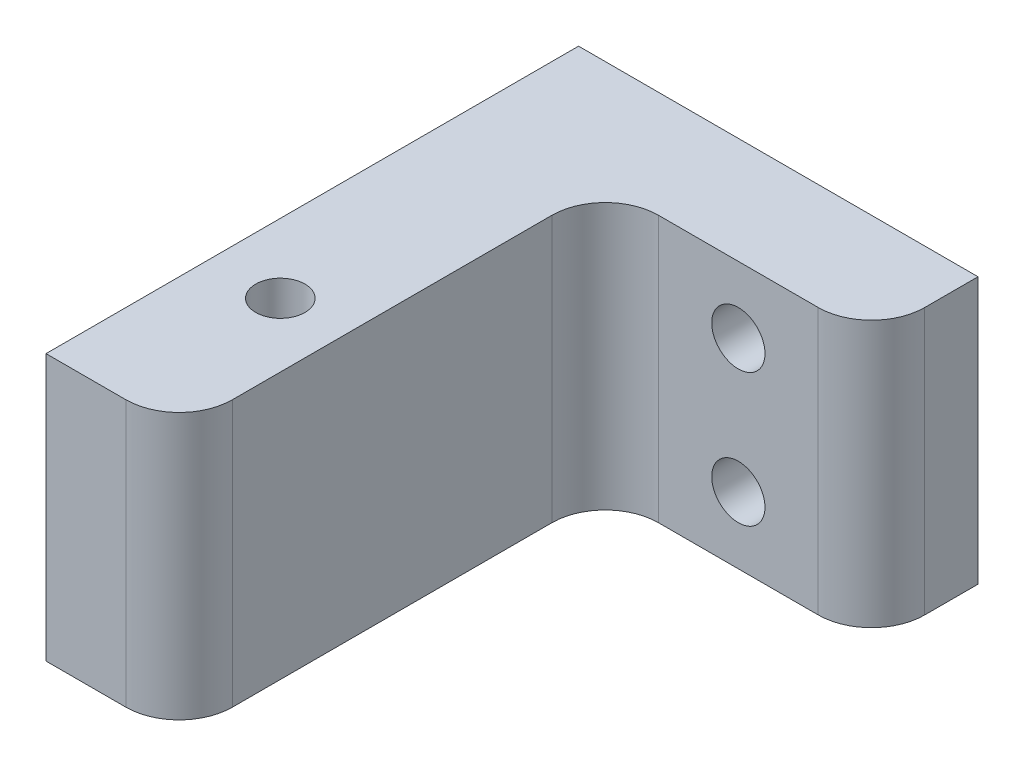
ISO-10303-21;
HEADER;
FILE_DESCRIPTION(('STEP AP214'),'2;1');
FILE_NAME('part.step','',(''),(''),'','','');
FILE_SCHEMA(('AUTOMOTIVE_DESIGN { 1 0 10303 214 1 1 1 1 }'));
ENDSEC;
DATA;
#1=APPLICATION_CONTEXT('core data for automotive mechanical design processes');
#2=APPLICATION_PROTOCOL_DEFINITION('international standard','automotive_design',2000,#1);
#3=PRODUCT_CONTEXT('',#1,'mechanical');
#4=PRODUCT('Part','Part','',(#3));
#5=PRODUCT_RELATED_PRODUCT_CATEGORY('part','',(#4));
#6=PRODUCT_DEFINITION_FORMATION('','',#4);
#7=PRODUCT_DEFINITION_CONTEXT('part definition',#1,'design');
#8=PRODUCT_DEFINITION('design','',#6,#7);
#9=PRODUCT_DEFINITION_SHAPE('','',#8);
#10=(LENGTH_UNIT() NAMED_UNIT(*) SI_UNIT(.MILLI.,.METRE.));
#11=(NAMED_UNIT(*) PLANE_ANGLE_UNIT() SI_UNIT($,.RADIAN.));
#12=(NAMED_UNIT(*) SI_UNIT($,.STERADIAN.) SOLID_ANGLE_UNIT());
#13=UNCERTAINTY_MEASURE_WITH_UNIT(LENGTH_MEASURE(1.E-05),#10,'distance_accuracy_value','');
#14=(GEOMETRIC_REPRESENTATION_CONTEXT(3) GLOBAL_UNCERTAINTY_ASSIGNED_CONTEXT((#13)) GLOBAL_UNIT_ASSIGNED_CONTEXT((#10,
#11,#12)) REPRESENTATION_CONTEXT('',''));
#15=CARTESIAN_POINT('',(0.,0.,0.));
#16=DIRECTION('',(0.,0.,1.));
#17=DIRECTION('',(1.,0.,0.));
#18=AXIS2_PLACEMENT_3D('',#15,#16,#17);
#19=CARTESIAN_POINT('',(-1.9948106859939,0.,-20.));
#20=DIRECTION('',(0.,0.,-1.));
#21=DIRECTION('',(-1.,0.,0.));
#22=AXIS2_PLACEMENT_3D('',#19,#20,#21);
#23=PLANE('',#22);
#24=CARTESIAN_POINT('',(-19.3554904609918,-13.5,-20.));
#25=DIRECTION('',(0.,0.,-1.));
#26=DIRECTION('',(-1.,0.,0.));
#27=AXIS2_PLACEMENT_3D('',#24,#25,#26);
#28=CIRCLE('',#27,1.);
#29=CARTESIAN_POINT('',(-20.3554904609918,-13.5,-20.));
#30=VERTEX_POINT('',#29);
#31=EDGE_CURVE('E336',#30,#30,#28,.T.);
#32=ORIENTED_EDGE('',*,*,#31,.F.);
#33=EDGE_LOOP('',(#32));
#34=FACE_BOUND('',#33,.T.);
#35=DIRECTION('',(-1.,0.,0.));
#36=VECTOR('',#35,1.);
#37=CARTESIAN_POINT('',(-1.9948106859939,-6.,-20.));
#38=LINE('',#37,#36);
#39=CARTESIAN_POINT('',(-14.3554904609918,-6.,-20.));
#40=VERTEX_POINT('',#39);
#41=CARTESIAN_POINT('',(-29.3554904609919,-6.,-20.));
#42=VERTEX_POINT('',#41);
#43=EDGE_CURVE('E134',#40,#42,#38,.T.);
#44=ORIENTED_EDGE('',*,*,#43,.F.);
#45=DIRECTION('',(0.,1.,0.));
#46=VECTOR('',#45,1.);
#47=CARTESIAN_POINT('',(-14.3554904609918,-16.,-20.));
#48=LINE('',#47,#46);
#49=CARTESIAN_POINT('',(-14.3554904609918,-16.,-20.));
#50=VERTEX_POINT('',#49);
#51=EDGE_CURVE('E118',#50,#40,#48,.T.);
#52=ORIENTED_EDGE('',*,*,#51,.F.);
#53=DIRECTION('',(-1.,0.,0.));
#54=VECTOR('',#53,1.);
#55=CARTESIAN_POINT('',(-1.9948106859939,-16.,-20.));
#56=LINE('',#55,#54);
#57=CARTESIAN_POINT('',(-29.3554904609919,-16.,-20.));
#58=VERTEX_POINT('',#57);
#59=EDGE_CURVE('E126',#50,#58,#56,.T.);
#60=ORIENTED_EDGE('',*,*,#59,.T.);
#61=DIRECTION('',(0.,-1.,0.));
#62=VECTOR('',#61,1.);
#63=CARTESIAN_POINT('',(-29.3554904609919,0.,-20.));
#64=LINE('',#63,#62);
#65=EDGE_CURVE('E167',#42,#58,#64,.T.);
#66=ORIENTED_EDGE('',*,*,#65,.F.);
#67=EDGE_LOOP('',(#44,#52,#60,#66));
#68=FACE_BOUND('',#67,.T.);
#69=CARTESIAN_POINT('',(-19.3554904609918,-8.5,-20.));
#70=DIRECTION('',(0.,0.,-1.));
#71=DIRECTION('',(-1.,0.,0.));
#72=AXIS2_PLACEMENT_3D('',#69,#70,#71);
#73=CIRCLE('',#72,1.);
#74=CARTESIAN_POINT('',(-20.3554904609918,-8.5,-20.));
#75=VERTEX_POINT('',#74);
#76=EDGE_CURVE('E123',#75,#75,#73,.F.);
#77=ORIENTED_EDGE('',*,*,#76,.T.);
#78=EDGE_LOOP('',(#77));
#79=FACE_BOUND('',#78,.T.);
#80=ADVANCED_FACE('F41',(#34,#68,#79),#23,.T.);
#81=CARTESIAN_POINT('',(-14.3554904609918,-16.,-16.));
#82=DIRECTION('',(0.,0.,-1.));
#83=DIRECTION('',(-1.,0.,0.));
#84=AXIS2_PLACEMENT_3D('',#81,#82,#83);
#85=PLANE('',#84);
#86=DIRECTION('',(-1.,0.,0.));
#87=VECTOR('',#86,1.);
#88=CARTESIAN_POINT('',(-14.3554904609918,-16.,-16.));
#89=LINE('',#88,#87);
#90=CARTESIAN_POINT('',(-16.3554904609918,-16.,-16.));
#91=VERTEX_POINT('',#90);
#92=CARTESIAN_POINT('',(-22.3554904609918,-16.,-16.));
#93=VERTEX_POINT('',#92);
#94=EDGE_CURVE('E145',#91,#93,#89,.T.);
#95=ORIENTED_EDGE('',*,*,#94,.F.);
#96=DIRECTION('',(0.,-1.,0.));
#97=VECTOR('',#96,1.);
#98=CARTESIAN_POINT('',(-16.3554904609918,-16.,-16.));
#99=LINE('',#98,#97);
#100=CARTESIAN_POINT('',(-16.3554904609918,-6.,-16.));
#101=VERTEX_POINT('',#100);
#102=EDGE_CURVE('E180',#91,#101,#99,.F.);
#103=ORIENTED_EDGE('',*,*,#102,.T.);
#104=DIRECTION('',(-1.,0.,0.));
#105=VECTOR('',#104,1.);
#106=CARTESIAN_POINT('',(-14.3554904609918,-6.,-16.));
#107=LINE('',#106,#105);
#108=CARTESIAN_POINT('',(-22.3554904609918,-6.,-16.));
#109=VERTEX_POINT('',#108);
#110=EDGE_CURVE('E139',#101,#109,#107,.T.);
#111=ORIENTED_EDGE('',*,*,#110,.T.);
#112=DIRECTION('',(0.,-1.,0.));
#113=VECTOR('',#112,1.);
#114=CARTESIAN_POINT('',(-22.3554904609918,-16.,-16.));
#115=LINE('',#114,#113);
#116=EDGE_CURVE('E177',#109,#93,#115,.T.);
#117=ORIENTED_EDGE('',*,*,#116,.T.);
#118=EDGE_LOOP('',(#95,#103,#111,#117));
#119=FACE_BOUND('',#118,.T.);
#120=CARTESIAN_POINT('',(-19.3554904609918,-13.5,-16.));
#121=DIRECTION('',(0.,0.,1.));
#122=DIRECTION('',(1.,0.,0.));
#123=AXIS2_PLACEMENT_3D('',#120,#121,#122);
#124=CIRCLE('',#123,1.);
#125=CARTESIAN_POINT('',(-18.3554904609918,-13.5,-16.));
#126=VERTEX_POINT('',#125);
#127=EDGE_CURVE('E339',#126,#126,#124,.F.);
#128=ORIENTED_EDGE('',*,*,#127,.T.);
#129=EDGE_LOOP('',(#128));
#130=FACE_BOUND('',#129,.T.);
#131=CARTESIAN_POINT('',(-19.3554904609918,-8.5,-16.));
#132=DIRECTION('',(0.,0.,1.));
#133=DIRECTION('',(1.,0.,0.));
#134=AXIS2_PLACEMENT_3D('',#131,#132,#133);
#135=CIRCLE('',#134,1.);
#136=CARTESIAN_POINT('',(-18.3554904609918,-8.5,-16.));
#137=VERTEX_POINT('',#136);
#138=EDGE_CURVE('E332',#137,#137,#135,.T.);
#139=ORIENTED_EDGE('',*,*,#138,.F.);
#140=EDGE_LOOP('',(#139));
#141=FACE_BOUND('',#140,.T.);
#142=ADVANCED_FACE('F204',(#119,#130,#141),#85,.F.);
#143=CARTESIAN_POINT('',(-24.3554904609918,-17.5,-6.1999999999999));
#144=DIRECTION('',(-1.,0.,0.));
#145=DIRECTION('',(0.,-1.,0.));
#146=AXIS2_PLACEMENT_3D('',#143,#144,#145);
#147=PLANE('',#146);
#148=DIRECTION('',(0.,0.,1.));
#149=VECTOR('',#148,1.);
#150=CARTESIAN_POINT('',(-24.3554904609918,-16.,0.));
#151=LINE('',#150,#149);
#152=CARTESIAN_POINT('',(-24.3554904609918,-16.,-14.));
#153=VERTEX_POINT('',#152);
#154=CARTESIAN_POINT('',(-24.3554904609918,-16.,-2.));
#155=VERTEX_POINT('',#154);
#156=EDGE_CURVE('E155',#153,#155,#151,.T.);
#157=ORIENTED_EDGE('',*,*,#156,.F.);
#158=DIRECTION('',(0.,-1.,0.));
#159=VECTOR('',#158,1.);
#160=CARTESIAN_POINT('',(-24.3554904609918,-6.,-14.));
#161=LINE('',#160,#159);
#162=CARTESIAN_POINT('',(-24.3554904609918,-6.,-14.));
#163=VERTEX_POINT('',#162);
#164=EDGE_CURVE('E187',#153,#163,#161,.F.);
#165=ORIENTED_EDGE('',*,*,#164,.T.);
#166=DIRECTION('',(0.,0.,1.));
#167=VECTOR('',#166,1.);
#168=CARTESIAN_POINT('',(-24.3554904609918,-6.,0.));
#169=LINE('',#168,#167);
#170=CARTESIAN_POINT('',(-24.3554904609918,-6.,-2.));
#171=VERTEX_POINT('',#170);
#172=EDGE_CURVE('E158',#163,#171,#169,.T.);
#173=ORIENTED_EDGE('',*,*,#172,.T.);
#174=DIRECTION('',(0.,1.,0.));
#175=VECTOR('',#174,1.);
#176=CARTESIAN_POINT('',(-24.3554904609918,-17.5,-2.));
#177=LINE('',#176,#175);
#178=EDGE_CURVE('E185',#171,#155,#177,.F.);
#179=ORIENTED_EDGE('',*,*,#178,.T.);
#180=EDGE_LOOP('',(#157,#165,#173,#179));
#181=FACE_BOUND('',#180,.T.);
#182=ADVANCED_FACE('F197',(#181),#147,.F.);
#183=CARTESIAN_POINT('',(-1.9948106859939,-6.,0.));
#184=DIRECTION('',(0.,1.,0.));
#185=DIRECTION('',(0.,0.,1.));
#186=AXIS2_PLACEMENT_3D('',#183,#184,#185);
#187=PLANE('',#186);
#188=CARTESIAN_POINT('',(-26.7554904609919,-6.,-6.1999999999999));
#189=DIRECTION('',(0.,1.,0.));
#190=DIRECTION('',(0.,0.,1.));
#191=AXIS2_PLACEMENT_3D('',#188,#189,#190);
#192=CIRCLE('',#191,0.925000000000039);
#193=CARTESIAN_POINT('',(-26.7554904609919,-6.,-7.12499999999994));
#194=VERTEX_POINT('',#193);
#195=EDGE_CURVE('E151',#194,#194,#192,.F.);
#196=ORIENTED_EDGE('',*,*,#195,.T.);
#197=EDGE_LOOP('',(#196));
#198=FACE_BOUND('',#197,.T.);
#199=ORIENTED_EDGE('',*,*,#110,.F.);
#200=CARTESIAN_POINT('',(-16.3554904609918,-6.,-18.));
#201=DIRECTION('',(0.,1.,0.));
#202=DIRECTION('',(0.,0.,1.));
#203=AXIS2_PLACEMENT_3D('',#200,#201,#202);
#204=CIRCLE('',#203,2.);
#205=CARTESIAN_POINT('',(-14.3554904609918,-6.,-18.));
#206=VERTEX_POINT('',#205);
#207=EDGE_CURVE('E183',#101,#206,#204,.T.);
#208=ORIENTED_EDGE('',*,*,#207,.T.);
#209=DIRECTION('',(0.,0.,1.));
#210=VECTOR('',#209,1.);
#211=CARTESIAN_POINT('',(-14.3554904609918,-6.,-16.));
#212=LINE('',#211,#210);
#213=EDGE_CURVE('E137',#40,#206,#212,.T.);
#214=ORIENTED_EDGE('',*,*,#213,.F.);
#215=ORIENTED_EDGE('',*,*,#43,.T.);
#216=DIRECTION('',(0.,0.,-1.));
#217=VECTOR('',#216,1.);
#218=CARTESIAN_POINT('',(-29.3554904609919,-6.,0.));
#219=LINE('',#218,#217);
#220=CARTESIAN_POINT('',(-29.3554904609919,-6.,0.));
#221=VERTEX_POINT('',#220);
#222=EDGE_CURVE('E154',#221,#42,#219,.T.);
#223=ORIENTED_EDGE('',*,*,#222,.F.);
#224=DIRECTION('',(-1.,0.,0.));
#225=VECTOR('',#224,1.);
#226=CARTESIAN_POINT('',(-1.9948106859939,-6.,0.));
#227=LINE('',#226,#225);
#228=CARTESIAN_POINT('',(-26.3554904609918,-6.,0.));
#229=VERTEX_POINT('',#228);
#230=EDGE_CURVE('E159',#229,#221,#227,.T.);
#231=ORIENTED_EDGE('',*,*,#230,.F.);
#232=CARTESIAN_POINT('',(-26.3554904609918,-6.,-2.));
#233=DIRECTION('',(0.,1.,0.));
#234=DIRECTION('',(0.,0.,1.));
#235=AXIS2_PLACEMENT_3D('',#232,#233,#234);
#236=CIRCLE('',#235,2.);
#237=EDGE_CURVE('E56',#229,#171,#236,.T.);
#238=ORIENTED_EDGE('',*,*,#237,.T.);
#239=ORIENTED_EDGE('',*,*,#172,.F.);
#240=CARTESIAN_POINT('',(-22.3554904609918,-6.,-14.));
#241=DIRECTION('',(0.,1.,0.));
#242=DIRECTION('',(0.,0.,1.));
#243=AXIS2_PLACEMENT_3D('',#240,#241,#242);
#244=CIRCLE('',#243,2.);
#245=EDGE_CURVE('E11',#163,#109,#244,.F.);
#246=ORIENTED_EDGE('',*,*,#245,.T.);
#247=EDGE_LOOP('',(#199,#208,#214,#215,#223,#231,#238,#239,#246));
#248=FACE_BOUND('',#247,.T.);
#249=ADVANCED_FACE('F201',(#198,#248),#187,.T.);
#250=CARTESIAN_POINT('',(-1.9948106859939,0.,0.));
#251=DIRECTION('',(0.,0.,-1.));
#252=DIRECTION('',(-1.,0.,0.));
#253=AXIS2_PLACEMENT_3D('',#250,#251,#252);
#254=PLANE('',#253);
#255=DIRECTION('',(-1.,0.,0.));
#256=VECTOR('',#255,1.);
#257=CARTESIAN_POINT('',(-1.9948106859939,-16.,0.));
#258=LINE('',#257,#256);
#259=CARTESIAN_POINT('',(-26.3554904609918,-16.,0.));
#260=VERTEX_POINT('',#259);
#261=CARTESIAN_POINT('',(-29.3554904609919,-16.,0.));
#262=VERTEX_POINT('',#261);
#263=EDGE_CURVE('E133',#260,#262,#258,.T.);
#264=ORIENTED_EDGE('',*,*,#263,.F.);
#265=DIRECTION('',(0.,1.,0.));
#266=VECTOR('',#265,1.);
#267=CARTESIAN_POINT('',(-26.3554904609918,0.,0.));
#268=LINE('',#267,#266);
#269=EDGE_CURVE('E189',#260,#229,#268,.T.);
#270=ORIENTED_EDGE('',*,*,#269,.T.);
#271=ORIENTED_EDGE('',*,*,#230,.T.);
#272=DIRECTION('',(0.,-1.,0.));
#273=VECTOR('',#272,1.);
#274=CARTESIAN_POINT('',(-29.3554904609919,0.,0.));
#275=LINE('',#274,#273);
#276=EDGE_CURVE('E163',#221,#262,#275,.T.);
#277=ORIENTED_EDGE('',*,*,#276,.T.);
#278=EDGE_LOOP('',(#264,#270,#271,#277));
#279=FACE_BOUND('',#278,.T.);
#280=ADVANCED_FACE('F215',(#279),#254,.F.);
#281=CARTESIAN_POINT('',(-1.9948106859939,-16.,0.));
#282=DIRECTION('',(0.,1.,0.));
#283=DIRECTION('',(0.,0.,1.));
#284=AXIS2_PLACEMENT_3D('',#281,#282,#283);
#285=PLANE('',#284);
#286=CARTESIAN_POINT('',(-26.7554904609919,-16.,-6.1999999999999));
#287=DIRECTION('',(0.,-1.,0.));
#288=DIRECTION('',(0.,0.,-1.));
#289=AXIS2_PLACEMENT_3D('',#286,#287,#288);
#290=CIRCLE('',#289,0.925000000000039);
#291=CARTESIAN_POINT('',(-26.7554904609919,-16.,-7.12499999999994));
#292=VERTEX_POINT('',#291);
#293=EDGE_CURVE('E148',#292,#292,#290,.T.);
#294=ORIENTED_EDGE('',*,*,#293,.F.);
#295=EDGE_LOOP('',(#294));
#296=FACE_BOUND('',#295,.T.);
#297=DIRECTION('',(0.,0.,-1.));
#298=VECTOR('',#297,1.);
#299=CARTESIAN_POINT('',(-14.3554904609918,-16.,-16.));
#300=LINE('',#299,#298);
#301=CARTESIAN_POINT('',(-14.3554904609918,-16.,-18.));
#302=VERTEX_POINT('',#301);
#303=EDGE_CURVE('E113',#302,#50,#300,.T.);
#304=ORIENTED_EDGE('',*,*,#303,.F.);
#305=CARTESIAN_POINT('',(-16.3554904609918,-16.,-18.));
#306=DIRECTION('',(0.,1.,0.));
#307=DIRECTION('',(0.,0.,1.));
#308=AXIS2_PLACEMENT_3D('',#305,#306,#307);
#309=CIRCLE('',#308,2.);
#310=EDGE_CURVE('E175',#302,#91,#309,.F.);
#311=ORIENTED_EDGE('',*,*,#310,.T.);
#312=ORIENTED_EDGE('',*,*,#94,.T.);
#313=CARTESIAN_POINT('',(-22.3554904609918,-16.,-14.));
#314=DIRECTION('',(0.,1.,0.));
#315=DIRECTION('',(0.,0.,1.));
#316=AXIS2_PLACEMENT_3D('',#313,#314,#315);
#317=CIRCLE('',#316,2.);
#318=EDGE_CURVE('E49',#93,#153,#317,.T.);
#319=ORIENTED_EDGE('',*,*,#318,.T.);
#320=ORIENTED_EDGE('',*,*,#156,.T.);
#321=CARTESIAN_POINT('',(-26.3554904609918,-16.,-2.));
#322=DIRECTION('',(0.,1.,0.));
#323=DIRECTION('',(0.,0.,1.));
#324=AXIS2_PLACEMENT_3D('',#321,#322,#323);
#325=CIRCLE('',#324,2.);
#326=EDGE_CURVE('E173',#155,#260,#325,.F.);
#327=ORIENTED_EDGE('',*,*,#326,.T.);
#328=ORIENTED_EDGE('',*,*,#263,.T.);
#329=DIRECTION('',(0.,0.,-1.));
#330=VECTOR('',#329,1.);
#331=CARTESIAN_POINT('',(-29.3554904609919,-16.,0.));
#332=LINE('',#331,#330);
#333=EDGE_CURVE('E129',#262,#58,#332,.T.);
#334=ORIENTED_EDGE('',*,*,#333,.T.);
#335=ORIENTED_EDGE('',*,*,#59,.F.);
#336=EDGE_LOOP('',(#304,#311,#312,#319,#320,#327,#328,#334,#335));
#337=FACE_BOUND('',#336,.T.);
#338=ADVANCED_FACE('F127',(#296,#337),#285,.F.);
#339=CARTESIAN_POINT('',(-29.3554904609919,0.,0.));
#340=DIRECTION('',(1.,0.,0.));
#341=DIRECTION('',(0.,0.,-1.));
#342=AXIS2_PLACEMENT_3D('',#339,#340,#341);
#343=PLANE('',#342);
#344=ORIENTED_EDGE('',*,*,#222,.T.);
#345=ORIENTED_EDGE('',*,*,#65,.T.);
#346=ORIENTED_EDGE('',*,*,#333,.F.);
#347=ORIENTED_EDGE('',*,*,#276,.F.);
#348=EDGE_LOOP('',(#344,#345,#346,#347));
#349=FACE_BOUND('',#348,.T.);
#350=ADVANCED_FACE('F212',(#349),#343,.F.);
#351=CARTESIAN_POINT('',(-26.7554904609919,-3.38370490960966,-6.1999999999999));
#352=DIRECTION('',(0.,-1.,0.));
#353=DIRECTION('',(0.,0.,-1.));
#354=AXIS2_PLACEMENT_3D('',#351,#352,#353);
#355=CYLINDRICAL_SURFACE('',#354,0.925000000000039);
#356=CARTESIAN_POINT('',(-26.7554904609919,-16.,-7.12499999999994));
#357=CARTESIAN_POINT('',(-26.7554904609919,-15.8958333333333,-7.12499999999994));
#358=CARTESIAN_POINT('',(-26.7554904609919,-15.7916666666667,-7.12499999999994));
#359=CARTESIAN_POINT('',(-26.7554904609919,-15.5833333333333,-7.12499999999994));
#360=CARTESIAN_POINT('',(-26.7554904609919,-15.4791666666667,-7.12499999999994));
#361=CARTESIAN_POINT('',(-26.7554904609919,-15.2708333333333,-7.12499999999994));
#362=CARTESIAN_POINT('',(-26.7554904609919,-15.1666666666667,-7.12499999999994));
#363=CARTESIAN_POINT('',(-26.7554904609919,-14.9583333333333,-7.12499999999994));
#364=CARTESIAN_POINT('',(-26.7554904609919,-14.8541666666667,-7.12499999999994));
#365=CARTESIAN_POINT('',(-26.7554904609919,-14.6458333333333,-7.12499999999994));
#366=CARTESIAN_POINT('',(-26.7554904609919,-14.5416666666667,-7.12499999999994));
#367=CARTESIAN_POINT('',(-26.7554904609919,-14.3333333333333,-7.12499999999994));
#368=CARTESIAN_POINT('',(-26.7554904609919,-14.2291666666667,-7.12499999999994));
#369=CARTESIAN_POINT('',(-26.7554904609919,-14.0208333333333,-7.12499999999994));
#370=CARTESIAN_POINT('',(-26.7554904609919,-13.9166666666667,-7.12499999999994));
#371=CARTESIAN_POINT('',(-26.7554904609919,-13.7083333333333,-7.12499999999994));
#372=CARTESIAN_POINT('',(-26.7554904609919,-13.6041666666667,-7.12499999999994));
#373=CARTESIAN_POINT('',(-26.7554904609919,-13.3958333333333,-7.12499999999994));
#374=CARTESIAN_POINT('',(-26.7554904609919,-13.2916666666667,-7.12499999999994));
#375=CARTESIAN_POINT('',(-26.7554904609919,-13.0833333333333,-7.12499999999994));
#376=CARTESIAN_POINT('',(-26.7554904609919,-12.9791666666667,-7.12499999999994));
#377=CARTESIAN_POINT('',(-26.7554904609919,-12.7708333333333,-7.12499999999994));
#378=CARTESIAN_POINT('',(-26.7554904609919,-12.6666666666667,-7.12499999999994));
#379=CARTESIAN_POINT('',(-26.7554904609919,-12.4583333333333,-7.12499999999994));
#380=CARTESIAN_POINT('',(-26.7554904609919,-12.3541666666667,-7.12499999999994));
#381=CARTESIAN_POINT('',(-26.7554904609919,-12.1458333333333,-7.12499999999994));
#382=CARTESIAN_POINT('',(-26.7554904609919,-12.0416666666667,-7.12499999999994));
#383=CARTESIAN_POINT('',(-26.7554904609919,-11.8333333333333,-7.12499999999994));
#384=CARTESIAN_POINT('',(-26.7554904609919,-11.7291666666667,-7.12499999999994));
#385=CARTESIAN_POINT('',(-26.7554904609919,-11.5208333333333,-7.12499999999994));
#386=CARTESIAN_POINT('',(-26.7554904609919,-11.4166666666667,-7.12499999999994));
#387=CARTESIAN_POINT('',(-26.7554904609919,-11.2083333333333,-7.12499999999994));
#388=CARTESIAN_POINT('',(-26.7554904609919,-11.1041666666667,-7.12499999999994));
#389=CARTESIAN_POINT('',(-26.7554904609919,-10.8958333333333,-7.12499999999994));
#390=CARTESIAN_POINT('',(-26.7554904609919,-10.7916666666667,-7.12499999999994));
#391=CARTESIAN_POINT('',(-26.7554904609919,-10.5833333333333,-7.12499999999994));
#392=CARTESIAN_POINT('',(-26.7554904609919,-10.4791666666667,-7.12499999999994));
#393=CARTESIAN_POINT('',(-26.7554904609919,-10.2708333333333,-7.12499999999994));
#394=CARTESIAN_POINT('',(-26.7554904609919,-10.1666666666667,-7.12499999999994));
#395=CARTESIAN_POINT('',(-26.7554904609919,-9.95833333333333,-7.12499999999994));
#396=CARTESIAN_POINT('',(-26.7554904609919,-9.85416666666667,-7.12499999999994));
#397=CARTESIAN_POINT('',(-26.7554904609919,-9.64583333333333,-7.12499999999994));
#398=CARTESIAN_POINT('',(-26.7554904609919,-9.54166666666667,-7.12499999999994));
#399=CARTESIAN_POINT('',(-26.7554904609919,-9.33333333333333,-7.12499999999994));
#400=CARTESIAN_POINT('',(-26.7554904609919,-9.22916666666666,-7.12499999999994));
#401=CARTESIAN_POINT('',(-26.7554904609919,-9.02083333333333,-7.12499999999994));
#402=CARTESIAN_POINT('',(-26.7554904609919,-8.91666666666666,-7.12499999999994));
#403=CARTESIAN_POINT('',(-26.7554904609919,-8.70833333333333,-7.12499999999994));
#404=CARTESIAN_POINT('',(-26.7554904609919,-8.60416666666667,-7.12499999999994));
#405=CARTESIAN_POINT('',(-26.7554904609919,-8.39583333333333,-7.12499999999994));
#406=CARTESIAN_POINT('',(-26.7554904609919,-8.29166666666667,-7.12499999999994));
#407=CARTESIAN_POINT('',(-26.7554904609919,-8.08333333333333,-7.12499999999994));
#408=CARTESIAN_POINT('',(-26.7554904609919,-7.97916666666667,-7.12499999999994));
#409=CARTESIAN_POINT('',(-26.7554904609919,-7.77083333333333,-7.12499999999994));
#410=CARTESIAN_POINT('',(-26.7554904609919,-7.66666666666667,-7.12499999999994));
#411=CARTESIAN_POINT('',(-26.7554904609919,-7.45833333333333,-7.12499999999994));
#412=CARTESIAN_POINT('',(-26.7554904609919,-7.35416666666667,-7.12499999999994));
#413=CARTESIAN_POINT('',(-26.7554904609919,-7.14583333333333,-7.12499999999994));
#414=CARTESIAN_POINT('',(-26.7554904609919,-7.04166666666667,-7.12499999999994));
#415=CARTESIAN_POINT('',(-26.7554904609919,-6.83333333333333,-7.12499999999994));
#416=CARTESIAN_POINT('',(-26.7554904609919,-6.72916666666667,-7.12499999999994));
#417=CARTESIAN_POINT('',(-26.7554904609919,-6.52083333333333,-7.12499999999994));
#418=CARTESIAN_POINT('',(-26.7554904609919,-6.41666666666667,-7.12499999999994));
#419=CARTESIAN_POINT('',(-26.7554904609919,-6.20833333333333,-7.12499999999994));
#420=CARTESIAN_POINT('',(-26.7554904609919,-6.10416666666667,-7.12499999999994));
#421=CARTESIAN_POINT('',(-26.7554904609919,-6.,-7.12499999999994));
#422=B_SPLINE_CURVE_WITH_KNOTS('',3,(#356,#357,#358,#359,#360,#361,#362,#363,#364,#365,#366,
#367,#368,#369,#370,#371,#372,#373,#374,#375,#376,#377,#378,#379,#380,#381,#382,#383,#384,#385,
#386,#387,#388,#389,#390,#391,#392,#393,#394,#395,#396,#397,#398,#399,#400,#401,#402,#403,#404,
#405,#406,#407,#408,#409,#410,#411,#412,#413,#414,#415,#416,#417,#418,#419,#420,#421),
.UNSPECIFIED.,.F.,.F.,(4,2,2,2,2,2,2,2,2,2,2,2,2,2,2,2,2,2,2,2,2,2,2,2,2,2,2,2,2,2,2,2,4),(0.,
0.3125,0.625000000000001,0.937499999999999,1.25,1.5625,1.875,2.1875,2.5,2.8125,3.125,3.4375,
3.75,4.0625,4.375,4.6875,5.,5.3125,5.625,5.9375,6.25,6.5625,6.875,7.1875,7.5,7.8125,8.125,
8.4375,8.75,9.0625,9.375,9.6875,10.),.UNSPECIFIED.);
#423=EDGE_CURVE('BSEAM248',#292,#194,#422,.T.);
#424=ORIENTED_EDGE('',*,*,#293,.T.);
#425=ORIENTED_EDGE('',*,*,#195,.F.);
#426=ORIENTED_EDGE('',*,*,#423,.T.);
#427=ORIENTED_EDGE('',*,*,#423,.F.);
#428=EDGE_LOOP('',(#424,#426,#425,#427));
#429=FACE_BOUND('',#428,.T.);
#430=ADVANCED_FACE('F248',(#429),#355,.F.);
#431=CARTESIAN_POINT('',(-14.3554904609918,0.,0.));
#432=DIRECTION('',(-1.,0.,0.));
#433=DIRECTION('',(0.,0.,1.));
#434=AXIS2_PLACEMENT_3D('',#431,#432,#433);
#435=PLANE('',#434);
#436=ORIENTED_EDGE('',*,*,#213,.T.);
#437=DIRECTION('',(0.,-1.,0.));
#438=VECTOR('',#437,1.);
#439=CARTESIAN_POINT('',(-14.3554904609918,0.,-18.));
#440=LINE('',#439,#438);
#441=EDGE_CURVE('E121',#206,#302,#440,.T.);
#442=ORIENTED_EDGE('',*,*,#441,.T.);
#443=ORIENTED_EDGE('',*,*,#303,.T.);
#444=ORIENTED_EDGE('',*,*,#51,.T.);
#445=EDGE_LOOP('',(#436,#442,#443,#444));
#446=FACE_BOUND('',#445,.T.);
#447=ADVANCED_FACE('F116',(#446),#435,.F.);
#448=CARTESIAN_POINT('',(-16.3554904609918,0.,-18.));
#449=DIRECTION('',(0.,-1.,0.));
#450=DIRECTION('',(0.,0.,-1.));
#451=AXIS2_PLACEMENT_3D('',#448,#449,#450);
#452=CYLINDRICAL_SURFACE('',#451,2.);
#453=ORIENTED_EDGE('',*,*,#207,.F.);
#454=ORIENTED_EDGE('',*,*,#102,.F.);
#455=ORIENTED_EDGE('',*,*,#310,.F.);
#456=ORIENTED_EDGE('',*,*,#441,.F.);
#457=EDGE_LOOP('',(#453,#454,#455,#456));
#458=FACE_BOUND('',#457,.T.);
#459=ADVANCED_FACE('F208',(#458),#452,.T.);
#460=CARTESIAN_POINT('',(-22.3554904609918,-16.,-14.));
#461=DIRECTION('',(0.,1.,0.));
#462=DIRECTION('',(0.,0.,1.));
#463=AXIS2_PLACEMENT_3D('',#460,#461,#462);
#464=CYLINDRICAL_SURFACE('',#463,2.);
#465=ORIENTED_EDGE('',*,*,#245,.F.);
#466=ORIENTED_EDGE('',*,*,#164,.F.);
#467=ORIENTED_EDGE('',*,*,#318,.F.);
#468=ORIENTED_EDGE('',*,*,#116,.F.);
#469=EDGE_LOOP('',(#465,#466,#467,#468));
#470=FACE_BOUND('',#469,.T.);
#471=ADVANCED_FACE('F199',(#470),#464,.F.);
#472=CARTESIAN_POINT('',(-26.3554904609918,0.,-2.));
#473=DIRECTION('',(0.,1.,0.));
#474=DIRECTION('',(0.,0.,1.));
#475=AXIS2_PLACEMENT_3D('',#472,#473,#474);
#476=CYLINDRICAL_SURFACE('',#475,2.);
#477=ORIENTED_EDGE('',*,*,#326,.F.);
#478=ORIENTED_EDGE('',*,*,#178,.F.);
#479=ORIENTED_EDGE('',*,*,#237,.F.);
#480=ORIENTED_EDGE('',*,*,#269,.F.);
#481=EDGE_LOOP('',(#477,#478,#479,#480));
#482=FACE_BOUND('',#481,.T.);
#483=ADVANCED_FACE('F43',(#482),#476,.T.);
#484=CARTESIAN_POINT('',(-19.3554904609918,-13.5,-22.8284271247462));
#485=DIRECTION('',(0.,0.,1.));
#486=DIRECTION('',(1.,0.,0.));
#487=AXIS2_PLACEMENT_3D('',#484,#485,#486);
#488=CYLINDRICAL_SURFACE('',#487,1.);
#489=ORIENTED_EDGE('',*,*,#127,.F.);
#490=EDGE_LOOP('',(#489));
#491=FACE_BOUND('',#490,.T.);
#492=ORIENTED_EDGE('',*,*,#31,.T.);
#493=EDGE_LOOP('',(#492));
#494=FACE_BOUND('',#493,.T.);
#495=ADVANCED_FACE('F217',(#491,#494),#488,.F.);
#496=CARTESIAN_POINT('',(-19.3554904609918,-8.5,-22.8284271247462));
#497=DIRECTION('',(0.,0.,1.));
#498=DIRECTION('',(1.,0.,0.));
#499=AXIS2_PLACEMENT_3D('',#496,#497,#498);
#500=CYLINDRICAL_SURFACE('',#499,1.);
#501=ORIENTED_EDGE('',*,*,#138,.T.);
#502=EDGE_LOOP('',(#501));
#503=FACE_BOUND('',#502,.T.);
#504=ORIENTED_EDGE('',*,*,#76,.F.);
#505=EDGE_LOOP('',(#504));
#506=FACE_BOUND('',#505,.T.);
#507=ADVANCED_FACE('F223',(#503,#506),#500,.F.);
#508=CLOSED_SHELL('',(#80,#142,#182,#249,#280,#338,#350,#430,#447,#459,#471,#483,#495,#507));
#509=MANIFOLD_SOLID_BREP('B2',#508);
#510=ADVANCED_BREP_SHAPE_REPRESENTATION('',(#18,#509),#14);
#511=SHAPE_DEFINITION_REPRESENTATION(#9,#510);
ENDSEC;
END-ISO-10303-21;
